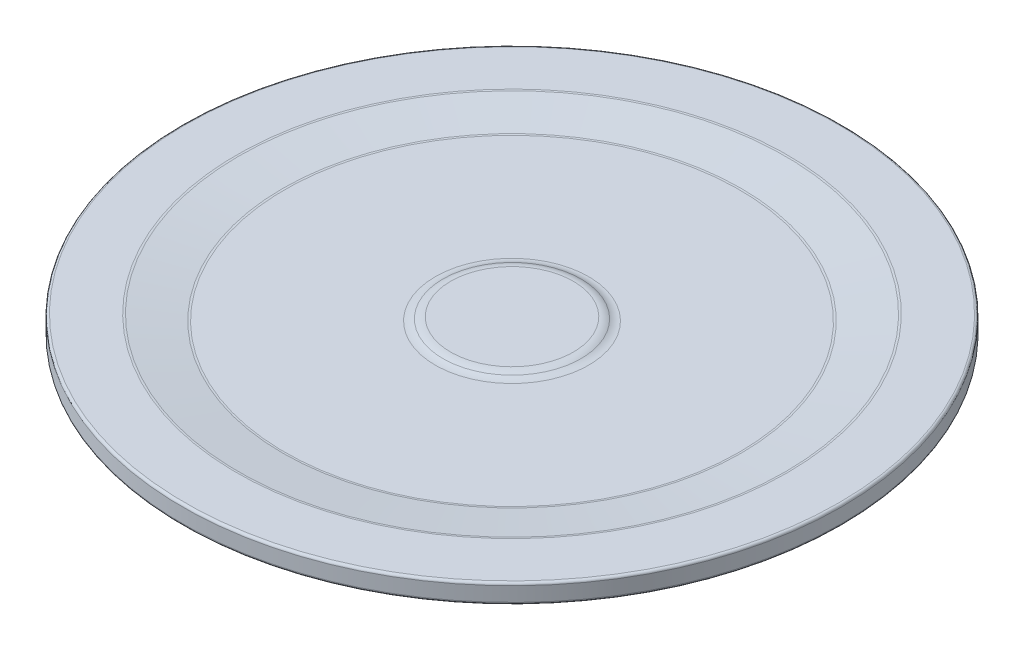
ISO-10303-21;
HEADER;
FILE_DESCRIPTION(('STEP AP214'),'2;1');
FILE_NAME('part.step','',(''),(''),'','','');
FILE_SCHEMA(('AUTOMOTIVE_DESIGN { 1 0 10303 214 1 1 1 1 }'));
ENDSEC;
DATA;
#1=APPLICATION_CONTEXT('core data for automotive mechanical design processes');
#2=APPLICATION_PROTOCOL_DEFINITION('international standard','automotive_design',2000,#1);
#3=PRODUCT_CONTEXT('',#1,'mechanical');
#4=PRODUCT('Part','Part','',(#3));
#5=PRODUCT_RELATED_PRODUCT_CATEGORY('part','',(#4));
#6=PRODUCT_DEFINITION_FORMATION('','',#4);
#7=PRODUCT_DEFINITION_CONTEXT('part definition',#1,'design');
#8=PRODUCT_DEFINITION('design','',#6,#7);
#9=PRODUCT_DEFINITION_SHAPE('','',#8);
#10=(LENGTH_UNIT() NAMED_UNIT(*) SI_UNIT(.MILLI.,.METRE.));
#11=(NAMED_UNIT(*) PLANE_ANGLE_UNIT() SI_UNIT($,.RADIAN.));
#12=(NAMED_UNIT(*) SI_UNIT($,.STERADIAN.) SOLID_ANGLE_UNIT());
#13=UNCERTAINTY_MEASURE_WITH_UNIT(LENGTH_MEASURE(1.E-05),#10,'distance_accuracy_value','');
#14=(GEOMETRIC_REPRESENTATION_CONTEXT(3) GLOBAL_UNCERTAINTY_ASSIGNED_CONTEXT((#13)) GLOBAL_UNIT_ASSIGNED_CONTEXT((#10,
#11,#12)) REPRESENTATION_CONTEXT('',''));
#15=CARTESIAN_POINT('',(0.,0.,0.));
#16=DIRECTION('',(0.,0.,1.));
#17=DIRECTION('',(1.,0.,0.));
#18=AXIS2_PLACEMENT_3D('',#15,#16,#17);
#19=CARTESIAN_POINT('',(0.,81.3593749999999,0.));
#20=DIRECTION('',(0.,1.,0.));
#21=DIRECTION('',(-1.,0.,0.));
#22=AXIS2_PLACEMENT_3D('',#19,#20,#21);
#23=CONICAL_SURFACE('',#22,28.4113417745367,1.4382447944982);
#24=CARTESIAN_POINT('',(0.,81.295875,0.));
#25=DIRECTION('',(0.,1.,0.));
#26=DIRECTION('',(-1.,0.,0.));
#27=AXIS2_PLACEMENT_3D('',#24,#25,#26);
#28=CIRCLE('',#27,27.9350917745368);
#29=CARTESIAN_POINT('',(-27.9350917745368,81.2958749999999,0.));
#30=VERTEX_POINT('',#29);
#31=EDGE_CURVE('E72',#30,#30,#28,.T.);
#32=ORIENTED_EDGE('',*,*,#31,.F.);
#33=EDGE_LOOP('',(#32));
#34=FACE_BOUND('',#33,.T.);
#35=CARTESIAN_POINT('',(0.,81.3593749999999,0.));
#36=DIRECTION('',(0.,1.,0.));
#37=DIRECTION('',(-1.,0.,0.));
#38=AXIS2_PLACEMENT_3D('',#35,#36,#37);
#39=CIRCLE('',#38,28.4113417745367);
#40=CARTESIAN_POINT('',(-28.4113417745367,81.3593749999999,0.));
#41=VERTEX_POINT('',#40);
#42=EDGE_CURVE('E11',#41,#41,#39,.T.);
#43=ORIENTED_EDGE('',*,*,#42,.T.);
#44=EDGE_LOOP('',(#43));
#45=FACE_BOUND('',#44,.T.);
#46=ADVANCED_FACE('F50',(#34,#45),#23,.F.);
#47=CARTESIAN_POINT('',(28.4113417745367,81.359375,0.));
#48=DIRECTION('',(0.,-1.,0.));
#49=DIRECTION('',(1.,0.,0.));
#50=AXIS2_PLACEMENT_3D('',#47,#48,#49);
#51=PLANE('',#50);
#52=ORIENTED_EDGE('',*,*,#42,.F.);
#53=EDGE_LOOP('',(#52));
#54=FACE_BOUND('',#53,.T.);
#55=CARTESIAN_POINT('',(0.,81.3593749999999,0.));
#56=DIRECTION('',(0.,1.,0.));
#57=DIRECTION('',(-1.,0.,0.));
#58=AXIS2_PLACEMENT_3D('',#55,#56,#57);
#59=CIRCLE('',#58,33.703125);
#60=CARTESIAN_POINT('',(-33.703125,81.3593749999999,0.));
#61=VERTEX_POINT('',#60);
#62=EDGE_CURVE('E56',#61,#61,#59,.T.);
#63=ORIENTED_EDGE('',*,*,#62,.T.);
#64=EDGE_LOOP('',(#63));
#65=FACE_BOUND('',#64,.T.);
#66=ADVANCED_FACE('F79',(#54,#65),#51,.F.);
#67=CARTESIAN_POINT('',(0.,82.55,0.));
#68=DIRECTION('',(0.,1.,0.));
#69=DIRECTION('',(-1.,0.,0.));
#70=AXIS2_PLACEMENT_3D('',#67,#68,#69);
#71=CYLINDRICAL_SURFACE('',#70,33.703125);
#72=ORIENTED_EDGE('',*,*,#62,.F.);
#73=EDGE_LOOP('',(#72));
#74=FACE_BOUND('',#73,.T.);
#75=CARTESIAN_POINT('',(0.,80.0893749999999,0.));
#76=DIRECTION('',(0.,1.,0.));
#77=DIRECTION('',(-1.,0.,0.));
#78=AXIS2_PLACEMENT_3D('',#75,#76,#77);
#79=CIRCLE('',#78,33.703125);
#80=CARTESIAN_POINT('',(-33.7031250000001,80.0893749999999,0.));
#81=VERTEX_POINT('',#80);
#82=EDGE_CURVE('E60',#81,#81,#79,.T.);
#83=ORIENTED_EDGE('',*,*,#82,.T.);
#84=EDGE_LOOP('',(#83));
#85=FACE_BOUND('',#84,.T.);
#86=ADVANCED_FACE('F83',(#74,#85),#71,.T.);
#87=CARTESIAN_POINT('',(0.,80.089375,0.));
#88=DIRECTION('',(0.,1.,0.));
#89=DIRECTION('',(-1.,0.,0.));
#90=AXIS2_PLACEMENT_3D('',#87,#88,#89);
#91=TOROIDAL_SURFACE('',#90,28.92475,4.77837500000007);
#92=ORIENTED_EDGE('',*,*,#82,.F.);
#93=EDGE_LOOP('',(#92));
#94=FACE_BOUND('',#93,.T.);
#95=CARTESIAN_POINT('',(0.,81.1983494027303,0.));
#96=DIRECTION('',(0.,1.,0.));
#97=DIRECTION('',(-1.,0.,0.));
#98=AXIS2_PLACEMENT_3D('',#95,#96,#97);
#99=CIRCLE('',#98,33.5726574232082);
#100=CARTESIAN_POINT('',(-33.5726574232082,81.1983494027303,0.));
#101=VERTEX_POINT('',#100);
#102=EDGE_CURVE('E64',#101,#101,#99,.T.);
#103=ORIENTED_EDGE('',*,*,#102,.T.);
#104=EDGE_LOOP('',(#103));
#105=FACE_BOUND('',#104,.T.);
#106=ADVANCED_FACE('F88',(#94,#105),#91,.F.);
#107=CARTESIAN_POINT('',(0.,81.1688749999999,0.));
#108=DIRECTION('',(0.,1.,0.));
#109=DIRECTION('',(-1.,0.,0.));
#110=AXIS2_PLACEMENT_3D('',#107,#108,#109);
#111=TOROIDAL_SURFACE('',#110,33.449125,0.127000000000006);
#112=ORIENTED_EDGE('',*,*,#102,.F.);
#113=EDGE_LOOP('',(#112));
#114=FACE_BOUND('',#113,.T.);
#115=CARTESIAN_POINT('',(0.,81.295875,0.));
#116=DIRECTION('',(0.,1.,0.));
#117=DIRECTION('',(-1.,0.,0.));
#118=AXIS2_PLACEMENT_3D('',#115,#116,#117);
#119=CIRCLE('',#118,33.449125);
#120=CARTESIAN_POINT('',(-33.4491250000001,81.2958749999999,0.));
#121=VERTEX_POINT('',#120);
#122=EDGE_CURVE('E69',#121,#121,#119,.T.);
#123=ORIENTED_EDGE('',*,*,#122,.T.);
#124=EDGE_LOOP('',(#123));
#125=FACE_BOUND('',#124,.T.);
#126=ADVANCED_FACE('F94',(#114,#125),#111,.F.);
#127=CARTESIAN_POINT('',(27.9350917745368,81.295875,0.));
#128=DIRECTION('',(0.,1.,0.));
#129=DIRECTION('',(-1.,0.,0.));
#130=AXIS2_PLACEMENT_3D('',#127,#128,#129);
#131=PLANE('',#130);
#132=ORIENTED_EDGE('',*,*,#122,.F.);
#133=EDGE_LOOP('',(#132));
#134=FACE_BOUND('',#133,.T.);
#135=ORIENTED_EDGE('',*,*,#31,.T.);
#136=EDGE_LOOP('',(#135));
#137=FACE_BOUND('',#136,.T.);
#138=ADVANCED_FACE('F76',(#134,#137),#131,.F.);
#139=CLOSED_SHELL('',(#46,#66,#86,#106,#126,#138));
#140=MANIFOLD_SOLID_BREP('B2',#139);
#141=CARTESIAN_POINT('',(0.,81.50225,0.));
#142=DIRECTION('',(0.,-1.,0.));
#143=DIRECTION('',(1.,0.,0.));
#144=AXIS2_PLACEMENT_3D('',#141,#142,#143);
#145=PLANE('',#144);
#146=CARTESIAN_POINT('',(0.,81.5022499999999,0.));
#147=DIRECTION('',(0.,1.,0.));
#148=DIRECTION('',(-1.,0.,0.));
#149=AXIS2_PLACEMENT_3D('',#146,#147,#148);
#150=CIRCLE('',#149,6.35000000000003);
#151=CARTESIAN_POINT('',(-6.35000000000006,81.5022499999999,0.));
#152=VERTEX_POINT('',#151);
#153=EDGE_CURVE('E219',#152,#152,#150,.T.);
#154=ORIENTED_EDGE('',*,*,#153,.T.);
#155=EDGE_LOOP('',(#154));
#156=FACE_BOUND('',#155,.T.);
#157=ADVANCED_FACE('F155',(#156),#145,.F.);
#158=CARTESIAN_POINT('',(0.,79.7533541666666,0.));
#159=DIRECTION('',(0.,1.,0.));
#160=DIRECTION('',(-1.,0.,0.));
#161=AXIS2_PLACEMENT_3D('',#158,#159,#160);
#162=TOROIDAL_SURFACE('',#161,6.35000000000002,1.74889583333333);
#163=ORIENTED_EDGE('',*,*,#153,.F.);
#164=EDGE_LOOP('',(#163));
#165=FACE_BOUND('',#164,.T.);
#166=CARTESIAN_POINT('',(0.,81.3117499999999,0.));
#167=DIRECTION('',(0.,1.,0.));
#168=DIRECTION('',(-1.,0.,0.));
#169=AXIS2_PLACEMENT_3D('',#166,#167,#168);
#170=CIRCLE('',#169,7.14375000000003);
#171=CARTESIAN_POINT('',(-7.14375000000005,81.3117499999999,0.));
#172=VERTEX_POINT('',#171);
#173=EDGE_CURVE('E223',#172,#172,#170,.T.);
#174=ORIENTED_EDGE('',*,*,#173,.T.);
#175=EDGE_LOOP('',(#174));
#176=FACE_BOUND('',#175,.T.);
#177=ADVANCED_FACE('F265',(#165,#176),#162,.T.);
#178=CARTESIAN_POINT('',(0.,82.8701458333333,0.));
#179=DIRECTION('',(0.,1.,0.));
#180=DIRECTION('',(-1.,0.,0.));
#181=AXIS2_PLACEMENT_3D('',#178,#179,#180);
#182=TOROIDAL_SURFACE('',#181,7.93750000000003,1.74889583333333);
#183=ORIENTED_EDGE('',*,*,#173,.F.);
#184=EDGE_LOOP('',(#183));
#185=FACE_BOUND('',#184,.T.);
#186=CARTESIAN_POINT('',(0.,81.1212499999999,0.));
#187=DIRECTION('',(0.,1.,0.));
#188=DIRECTION('',(-1.,0.,0.));
#189=AXIS2_PLACEMENT_3D('',#186,#187,#188);
#190=CIRCLE('',#189,7.93750000000003);
#191=CARTESIAN_POINT('',(-7.93750000000005,81.1212499999999,0.));
#192=VERTEX_POINT('',#191);
#193=EDGE_CURVE('E227',#192,#192,#190,.T.);
#194=ORIENTED_EDGE('',*,*,#193,.T.);
#195=EDGE_LOOP('',(#194));
#196=FACE_BOUND('',#195,.T.);
#197=ADVANCED_FACE('F271',(#185,#196),#182,.F.);
#198=CARTESIAN_POINT('',(7.9375,81.1212499999999,0.));
#199=DIRECTION('',(0.,-1.,0.));
#200=DIRECTION('',(1.,0.,0.));
#201=AXIS2_PLACEMENT_3D('',#198,#199,#200);
#202=PLANE('',#201);
#203=CARTESIAN_POINT('',(0.,81.1212499999999,0.));
#204=DIRECTION('',(0.,-1.,0.));
#205=DIRECTION('',(1.,0.,0.));
#206=AXIS2_PLACEMENT_3D('',#203,#204,#205);
#207=CIRCLE('',#206,23.5213475857789);
#208=CARTESIAN_POINT('',(23.5213475857789,81.12125,0.));
#209=VERTEX_POINT('',#208);
#210=EDGE_CURVE('E49',#209,#209,#207,.F.);
#211=ORIENTED_EDGE('',*,*,#210,.T.);
#212=EDGE_LOOP('',(#211));
#213=FACE_BOUND('',#212,.T.);
#214=ORIENTED_EDGE('',*,*,#193,.F.);
#215=EDGE_LOOP('',(#214));
#216=FACE_BOUND('',#215,.T.);
#217=ADVANCED_FACE('F313',(#213,#216),#202,.F.);
#218=CARTESIAN_POINT('',(0.,81.7562499999999,0.));
#219=DIRECTION('',(0.,1.,0.));
#220=DIRECTION('',(-1.,0.,0.));
#221=AXIS2_PLACEMENT_3D('',#218,#219,#220);
#222=CONICAL_SURFACE('',#221,28.385,1.43824479449823);
#223=CARTESIAN_POINT('',(0.,81.7428813206403,0.));
#224=DIRECTION('',(0.,-1.,0.));
#225=DIRECTION('',(1.,0.,0.));
#226=AXIS2_PLACEMENT_3D('',#223,#224,#225);
#227=CIRCLE('',#226,28.2847349048026);
#228=CARTESIAN_POINT('',(28.2847349048025,81.7428813206403,0.));
#229=VERTEX_POINT('',#228);
#230=EDGE_CURVE('E163',#229,#229,#227,.F.);
#231=ORIENTED_EDGE('',*,*,#230,.T.);
#232=EDGE_LOOP('',(#231));
#233=FACE_BOUND('',#232,.T.);
#234=CARTESIAN_POINT('',(0.,81.1346186793596,0.));
#235=DIRECTION('',(0.,1.,0.));
#236=DIRECTION('',(-1.,0.,0.));
#237=AXIS2_PLACEMENT_3D('',#234,#235,#236);
#238=CIRCLE('',#237,23.7227650951976);
#239=CARTESIAN_POINT('',(-23.7227650951976,81.1346186793595,0.));
#240=VERTEX_POINT('',#239);
#241=EDGE_CURVE('E168',#240,#240,#238,.F.);
#242=ORIENTED_EDGE('',*,*,#241,.T.);
#243=EDGE_LOOP('',(#242));
#244=FACE_BOUND('',#243,.T.);
#245=ADVANCED_FACE('F303',(#233,#244),#222,.F.);
#246=CARTESIAN_POINT('',(28.385,81.75625,0.));
#247=DIRECTION('',(0.,-1.,0.));
#248=DIRECTION('',(1.,0.,0.));
#249=AXIS2_PLACEMENT_3D('',#246,#247,#248);
#250=PLANE('',#249);
#251=CARTESIAN_POINT('',(0.,81.7562499999999,0.));
#252=DIRECTION('',(0.,-1.,0.));
#253=DIRECTION('',(1.,0.,0.));
#254=AXIS2_PLACEMENT_3D('',#251,#252,#253);
#255=CIRCLE('',#254,33.846);
#256=CARTESIAN_POINT('',(33.846,81.75625,0.));
#257=VERTEX_POINT('',#256);
#258=EDGE_CURVE('E187',#257,#257,#255,.F.);
#259=ORIENTED_EDGE('',*,*,#258,.T.);
#260=EDGE_LOOP('',(#259));
#261=FACE_BOUND('',#260,.T.);
#262=CARTESIAN_POINT('',(0.,81.7562499999999,0.));
#263=DIRECTION('',(0.,-1.,0.));
#264=DIRECTION('',(1.,0.,0.));
#265=AXIS2_PLACEMENT_3D('',#262,#263,#264);
#266=CIRCLE('',#265,28.4861524142213);
#267=CARTESIAN_POINT('',(28.4861524142212,81.75625,0.));
#268=VERTEX_POINT('',#267);
#269=EDGE_CURVE('E191',#268,#268,#266,.T.);
#270=ORIENTED_EDGE('',*,*,#269,.T.);
#271=EDGE_LOOP('',(#270));
#272=FACE_BOUND('',#271,.T.);
#273=ADVANCED_FACE('F300',(#261,#272),#250,.F.);
#274=CARTESIAN_POINT('',(0.,82.55,0.));
#275=DIRECTION('',(0.,1.,0.));
#276=DIRECTION('',(-1.,0.,0.));
#277=AXIS2_PLACEMENT_3D('',#274,#275,#276);
#278=CYLINDRICAL_SURFACE('',#277,34.1);
#279=CARTESIAN_POINT('',(0.,80.0102499999999,0.));
#280=DIRECTION('',(0.,1.,0.));
#281=DIRECTION('',(-1.,0.,0.));
#282=AXIS2_PLACEMENT_3D('',#279,#280,#281);
#283=CIRCLE('',#282,34.1);
#284=CARTESIAN_POINT('',(-34.1000000000001,80.0102499999999,0.));
#285=VERTEX_POINT('',#284);
#286=EDGE_CURVE('E211',#285,#285,#283,.T.);
#287=ORIENTED_EDGE('',*,*,#286,.T.);
#288=EDGE_LOOP('',(#287));
#289=FACE_BOUND('',#288,.T.);
#290=CARTESIAN_POINT('',(0.,81.5022499999999,0.));
#291=DIRECTION('',(0.,-1.,0.));
#292=DIRECTION('',(1.,0.,0.));
#293=AXIS2_PLACEMENT_3D('',#290,#291,#292);
#294=CIRCLE('',#293,34.1);
#295=CARTESIAN_POINT('',(34.1,81.50225,0.));
#296=VERTEX_POINT('',#295);
#297=EDGE_CURVE('E215',#296,#296,#294,.T.);
#298=ORIENTED_EDGE('',*,*,#297,.T.);
#299=EDGE_LOOP('',(#298));
#300=FACE_BOUND('',#299,.T.);
#301=ADVANCED_FACE('F302',(#289,#300),#278,.T.);
#302=CARTESIAN_POINT('',(34.1,79.75625,0.));
#303=DIRECTION('',(0.,1.,0.));
#304=DIRECTION('',(-1.,0.,0.));
#305=AXIS2_PLACEMENT_3D('',#302,#303,#304);
#306=PLANE('',#305);
#307=CARTESIAN_POINT('',(0.,79.7562499999999,0.));
#308=DIRECTION('',(0.,1.,0.));
#309=DIRECTION('',(-1.,0.,0.));
#310=AXIS2_PLACEMENT_3D('',#307,#308,#309);
#311=CIRCLE('',#310,33.846);
#312=CARTESIAN_POINT('',(-33.8460000000001,79.7562499999999,0.));
#313=VERTEX_POINT('',#312);
#314=EDGE_CURVE('E207',#313,#313,#311,.F.);
#315=ORIENTED_EDGE('',*,*,#314,.T.);
#316=EDGE_LOOP('',(#315));
#317=FACE_BOUND('',#316,.T.);
#318=CARTESIAN_POINT('',(0.,79.7562499999999,0.));
#319=DIRECTION('',(0.,1.,0.));
#320=DIRECTION('',(-1.,0.,0.));
#321=AXIS2_PLACEMENT_3D('',#318,#319,#320);
#322=CIRCLE('',#321,33.703125);
#323=CARTESIAN_POINT('',(-33.7031250000001,79.7562499999999,0.));
#324=VERTEX_POINT('',#323);
#325=EDGE_CURVE('E231',#324,#324,#322,.T.);
#326=ORIENTED_EDGE('',*,*,#325,.T.);
#327=EDGE_LOOP('',(#326));
#328=FACE_BOUND('',#327,.T.);
#329=ADVANCED_FACE('F310',(#317,#328),#306,.F.);
#330=CARTESIAN_POINT('',(0.,82.55,0.));
#331=DIRECTION('',(0.,1.,0.));
#332=DIRECTION('',(-1.,0.,0.));
#333=AXIS2_PLACEMENT_3D('',#330,#331,#332);
#334=CYLINDRICAL_SURFACE('',#333,33.703125);
#335=CARTESIAN_POINT('',(0.,81.1053749999999,0.));
#336=DIRECTION('',(0.,1.,0.));
#337=DIRECTION('',(-1.,0.,0.));
#338=AXIS2_PLACEMENT_3D('',#335,#336,#337);
#339=CIRCLE('',#338,33.703125);
#340=CARTESIAN_POINT('',(-33.7031250000001,81.1053749999998,0.));
#341=VERTEX_POINT('',#340);
#342=EDGE_CURVE('E203',#341,#341,#339,.T.);
#343=ORIENTED_EDGE('',*,*,#342,.T.);
#344=EDGE_LOOP('',(#343));
#345=FACE_BOUND('',#344,.T.);
#346=ORIENTED_EDGE('',*,*,#325,.F.);
#347=EDGE_LOOP('',(#346));
#348=FACE_BOUND('',#347,.T.);
#349=ADVANCED_FACE('F360',(#345,#348),#334,.F.);
#350=CARTESIAN_POINT('',(28.4113417745367,81.359375,0.));
#351=DIRECTION('',(0.,1.,0.));
#352=DIRECTION('',(-1.,0.,0.));
#353=AXIS2_PLACEMENT_3D('',#350,#351,#352);
#354=PLANE('',#353);
#355=CARTESIAN_POINT('',(0.,81.3593749999999,0.));
#356=DIRECTION('',(0.,1.,0.));
#357=DIRECTION('',(-1.,0.,0.));
#358=AXIS2_PLACEMENT_3D('',#355,#356,#357);
#359=CIRCLE('',#358,33.449125);
#360=CARTESIAN_POINT('',(-33.4491250000001,81.3593749999998,0.));
#361=VERTEX_POINT('',#360);
#362=EDGE_CURVE('E195',#361,#361,#359,.F.);
#363=ORIENTED_EDGE('',*,*,#362,.T.);
#364=EDGE_LOOP('',(#363));
#365=FACE_BOUND('',#364,.T.);
#366=CARTESIAN_POINT('',(0.,81.3593749999999,0.));
#367=DIRECTION('',(0.,1.,0.));
#368=DIRECTION('',(-1.,0.,0.));
#369=AXIS2_PLACEMENT_3D('',#366,#367,#368);
#370=CIRCLE('',#369,28.512494188758);
#371=CARTESIAN_POINT('',(-28.512494188758,81.3593749999998,0.));
#372=VERTEX_POINT('',#371);
#373=EDGE_CURVE('E199',#372,#372,#370,.T.);
#374=ORIENTED_EDGE('',*,*,#373,.T.);
#375=EDGE_LOOP('',(#374));
#376=FACE_BOUND('',#375,.T.);
#377=ADVANCED_FACE('F370',(#365,#376),#354,.F.);
#378=CARTESIAN_POINT('',(0.,80.7243749999999,0.));
#379=DIRECTION('',(0.,1.,0.));
#380=DIRECTION('',(-1.,0.,0.));
#381=AXIS2_PLACEMENT_3D('',#378,#379,#380);
#382=CONICAL_SURFACE('',#381,23.6488417745368,1.43824479449823);
#383=CARTESIAN_POINT('',(0.,81.3460063206402,0.));
#384=DIRECTION('',(0.,1.,0.));
#385=DIRECTION('',(-1.,0.,0.));
#386=AXIS2_PLACEMENT_3D('',#383,#384,#385);
#387=CIRCLE('',#386,28.3110766793393);
#388=CARTESIAN_POINT('',(-28.3110766793393,81.3460063206402,0.));
#389=VERTEX_POINT('',#388);
#390=EDGE_CURVE('E179',#389,#389,#387,.F.);
#391=ORIENTED_EDGE('',*,*,#390,.T.);
#392=EDGE_LOOP('',(#391));
#393=FACE_BOUND('',#392,.T.);
#394=CARTESIAN_POINT('',(0.,80.7377436793596,0.));
#395=DIRECTION('',(0.,-1.,0.));
#396=DIRECTION('',(1.,0.,0.));
#397=AXIS2_PLACEMENT_3D('',#394,#395,#396);
#398=CIRCLE('',#397,23.7491068697344);
#399=CARTESIAN_POINT('',(23.7491068697344,80.7377436793596,0.));
#400=VERTEX_POINT('',#399);
#401=EDGE_CURVE('E183',#400,#400,#398,.F.);
#402=ORIENTED_EDGE('',*,*,#401,.T.);
#403=EDGE_LOOP('',(#402));
#404=FACE_BOUND('',#403,.T.);
#405=ADVANCED_FACE('F381',(#393,#404),#382,.T.);
#406=CARTESIAN_POINT('',(7.9375,80.724375,0.));
#407=DIRECTION('',(0.,1.,0.));
#408=DIRECTION('',(-1.,0.,0.));
#409=AXIS2_PLACEMENT_3D('',#406,#407,#408);
#410=PLANE('',#409);
#411=CARTESIAN_POINT('',(0.,80.7243749999999,0.));
#412=DIRECTION('',(0.,1.,0.));
#413=DIRECTION('',(-1.,0.,0.));
#414=AXIS2_PLACEMENT_3D('',#411,#412,#413);
#415=CIRCLE('',#414,23.5476893603157);
#416=CARTESIAN_POINT('',(-23.5476893603157,80.7243749999999,0.));
#417=VERTEX_POINT('',#416);
#418=EDGE_CURVE('E173',#417,#417,#415,.F.);
#419=ORIENTED_EDGE('',*,*,#418,.T.);
#420=EDGE_LOOP('',(#419));
#421=FACE_BOUND('',#420,.T.);
#422=CARTESIAN_POINT('',(0.,80.724375,0.));
#423=DIRECTION('',(0.,1.,0.));
#424=DIRECTION('',(-1.,0.,0.));
#425=AXIS2_PLACEMENT_3D('',#422,#423,#424);
#426=CIRCLE('',#425,7.93750000000003);
#427=CARTESIAN_POINT('',(-7.93750000000005,80.7243749999999,0.));
#428=VERTEX_POINT('',#427);
#429=EDGE_CURVE('E235',#428,#428,#426,.T.);
#430=ORIENTED_EDGE('',*,*,#429,.T.);
#431=EDGE_LOOP('',(#430));
#432=FACE_BOUND('',#431,.T.);
#433=ADVANCED_FACE('F392',(#421,#432),#410,.F.);
#434=CARTESIAN_POINT('',(0.,82.8701458333333,0.));
#435=DIRECTION('',(0.,1.,0.));
#436=DIRECTION('',(-1.,0.,0.));
#437=AXIS2_PLACEMENT_3D('',#434,#435,#436);
#438=TOROIDAL_SURFACE('',#437,7.93750000000003,2.14577083333334);
#439=ORIENTED_EDGE('',*,*,#429,.F.);
#440=EDGE_LOOP('',(#439));
#441=FACE_BOUND('',#440,.T.);
#442=CARTESIAN_POINT('',(0.,80.9581049546142,0.));
#443=DIRECTION('',(0.,1.,0.));
#444=DIRECTION('',(-1.,0.,0.));
#445=AXIS2_PLACEMENT_3D('',#442,#443,#444);
#446=CIRCLE('',#445,6.96362518910744);
#447=CARTESIAN_POINT('',(-6.96362518910746,80.9581049546142,0.));
#448=VERTEX_POINT('',#447);
#449=EDGE_CURVE('E239',#448,#448,#446,.T.);
#450=ORIENTED_EDGE('',*,*,#449,.T.);
#451=EDGE_LOOP('',(#450));
#452=FACE_BOUND('',#451,.T.);
#453=ADVANCED_FACE('F261',(#441,#452),#438,.T.);
#454=CARTESIAN_POINT('',(0.,79.7533541666666,0.));
#455=DIRECTION('',(0.,1.,0.));
#456=DIRECTION('',(-1.,0.,0.));
#457=AXIS2_PLACEMENT_3D('',#454,#455,#456);
#458=TOROIDAL_SURFACE('',#457,6.35000000000002,1.35202083333334);
#459=ORIENTED_EDGE('',*,*,#449,.F.);
#460=EDGE_LOOP('',(#459));
#461=FACE_BOUND('',#460,.T.);
#462=CARTESIAN_POINT('',(0.,81.105375,0.));
#463=DIRECTION('',(0.,1.,0.));
#464=DIRECTION('',(-1.,0.,0.));
#465=AXIS2_PLACEMENT_3D('',#462,#463,#464);
#466=CIRCLE('',#465,6.35000000000003);
#467=CARTESIAN_POINT('',(-6.35000000000005,81.1053749999999,0.));
#468=VERTEX_POINT('',#467);
#469=EDGE_CURVE('E243',#468,#468,#466,.T.);
#470=ORIENTED_EDGE('',*,*,#469,.T.);
#471=EDGE_LOOP('',(#470));
#472=FACE_BOUND('',#471,.T.);
#473=ADVANCED_FACE('F248',(#461,#472),#458,.F.);
#474=CARTESIAN_POINT('',(0.,81.105375,0.));
#475=DIRECTION('',(0.,1.,0.));
#476=DIRECTION('',(-1.,0.,0.));
#477=AXIS2_PLACEMENT_3D('',#474,#475,#476);
#478=PLANE('',#477);
#479=ORIENTED_EDGE('',*,*,#469,.F.);
#480=EDGE_LOOP('',(#479));
#481=FACE_BOUND('',#480,.T.);
#482=ADVANCED_FACE('F250',(#481),#478,.F.);
#483=CARTESIAN_POINT('',(0.,80.0102499999999,0.));
#484=DIRECTION('',(0.,1.,0.));
#485=DIRECTION('',(-1.,0.,0.));
#486=AXIS2_PLACEMENT_3D('',#483,#484,#485);
#487=TOROIDAL_SURFACE('',#486,33.846,0.254);
#488=ORIENTED_EDGE('',*,*,#314,.F.);
#489=EDGE_LOOP('',(#488));
#490=FACE_BOUND('',#489,.T.);
#491=ORIENTED_EDGE('',*,*,#286,.F.);
#492=EDGE_LOOP('',(#491));
#493=FACE_BOUND('',#492,.T.);
#494=ADVANCED_FACE('F252',(#490,#493),#487,.T.);
#495=CARTESIAN_POINT('',(0.,81.1053749999999,0.));
#496=DIRECTION('',(0.,1.,0.));
#497=DIRECTION('',(-1.,0.,0.));
#498=AXIS2_PLACEMENT_3D('',#495,#496,#497);
#499=TOROIDAL_SURFACE('',#498,33.449125,0.254);
#500=ORIENTED_EDGE('',*,*,#362,.F.);
#501=EDGE_LOOP('',(#500));
#502=FACE_BOUND('',#501,.T.);
#503=ORIENTED_EDGE('',*,*,#342,.F.);
#504=EDGE_LOOP('',(#503));
#505=FACE_BOUND('',#504,.T.);
#506=ADVANCED_FACE('F258',(#502,#505),#499,.F.);
#507=CARTESIAN_POINT('',(0.,81.5022499999999,0.));
#508=DIRECTION('',(0.,-1.,0.));
#509=DIRECTION('',(1.,0.,0.));
#510=AXIS2_PLACEMENT_3D('',#507,#508,#509);
#511=TOROIDAL_SURFACE('',#510,33.846,0.254);
#512=ORIENTED_EDGE('',*,*,#297,.F.);
#513=EDGE_LOOP('',(#512));
#514=FACE_BOUND('',#513,.T.);
#515=ORIENTED_EDGE('',*,*,#258,.F.);
#516=EDGE_LOOP('',(#515));
#517=FACE_BOUND('',#516,.T.);
#518=ADVANCED_FACE('F278',(#514,#517),#511,.T.);
#519=CARTESIAN_POINT('',(0.,79.8353749999999,0.));
#520=DIRECTION('',(0.,1.,0.));
#521=DIRECTION('',(-1.,0.,0.));
#522=AXIS2_PLACEMENT_3D('',#519,#520,#521);
#523=TOROIDAL_SURFACE('',#522,28.512494188758,1.524);
#524=ORIENTED_EDGE('',*,*,#390,.F.);
#525=EDGE_LOOP('',(#524));
#526=FACE_BOUND('',#525,.T.);
#527=ORIENTED_EDGE('',*,*,#373,.F.);
#528=EDGE_LOOP('',(#527));
#529=FACE_BOUND('',#528,.T.);
#530=ADVANCED_FACE('F282',(#526,#529),#523,.F.);
#531=CARTESIAN_POINT('',(0.,82.2483749999999,0.));
#532=DIRECTION('',(0.,1.,0.));
#533=DIRECTION('',(-1.,0.,0.));
#534=AXIS2_PLACEMENT_3D('',#531,#532,#533);
#535=TOROIDAL_SURFACE('',#534,23.5476893603157,1.524);
#536=ORIENTED_EDGE('',*,*,#418,.F.);
#537=EDGE_LOOP('',(#536));
#538=FACE_BOUND('',#537,.T.);
#539=ORIENTED_EDGE('',*,*,#401,.F.);
#540=EDGE_LOOP('',(#539));
#541=FACE_BOUND('',#540,.T.);
#542=ADVANCED_FACE('F286',(#538,#541),#535,.T.);
#543=CARTESIAN_POINT('',(0.,80.2322499999999,0.));
#544=DIRECTION('',(0.,-1.,0.));
#545=DIRECTION('',(1.,0.,0.));
#546=AXIS2_PLACEMENT_3D('',#543,#544,#545);
#547=TOROIDAL_SURFACE('',#546,28.4861524142213,1.524);
#548=ORIENTED_EDGE('',*,*,#269,.F.);
#549=EDGE_LOOP('',(#548));
#550=FACE_BOUND('',#549,.T.);
#551=ORIENTED_EDGE('',*,*,#230,.F.);
#552=EDGE_LOOP('',(#551));
#553=FACE_BOUND('',#552,.T.);
#554=ADVANCED_FACE('F289',(#550,#553),#547,.T.);
#555=CARTESIAN_POINT('',(0.,82.6452499999999,0.));
#556=DIRECTION('',(0.,-1.,0.));
#557=DIRECTION('',(1.,0.,0.));
#558=AXIS2_PLACEMENT_3D('',#555,#556,#557);
#559=TOROIDAL_SURFACE('',#558,23.5213475857789,1.524);
#560=ORIENTED_EDGE('',*,*,#241,.F.);
#561=EDGE_LOOP('',(#560));
#562=FACE_BOUND('',#561,.T.);
#563=ORIENTED_EDGE('',*,*,#210,.F.);
#564=EDGE_LOOP('',(#563));
#565=FACE_BOUND('',#564,.T.);
#566=ADVANCED_FACE('F157',(#562,#565),#559,.F.);
#567=CLOSED_SHELL('',(#157,#177,#197,#217,#245,#273,#301,#329,#349,#377,#405,#433,#453,#473,
#482,#494,#506,#518,#530,#542,#554,#566));
#568=MANIFOLD_SOLID_BREP('B6',#567);
#569=ADVANCED_BREP_SHAPE_REPRESENTATION('',(#18,#140,#568),#14);
#570=SHAPE_DEFINITION_REPRESENTATION(#9,#569);
ENDSEC;
END-ISO-10303-21;
